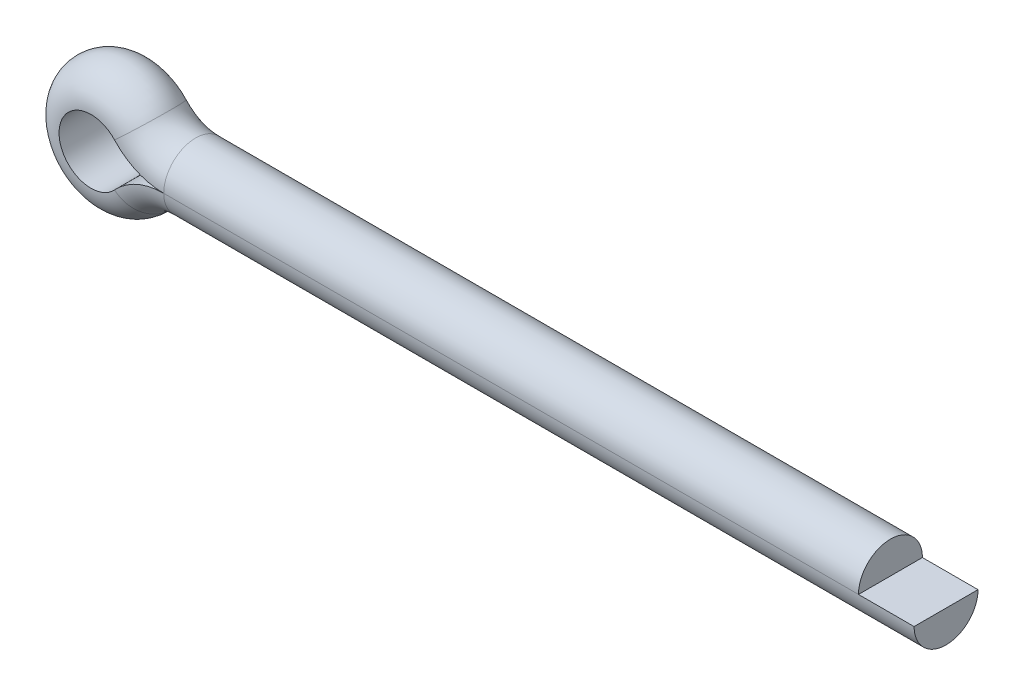
ISO-10303-21;
HEADER;
FILE_DESCRIPTION(('STEP AP214'),'2;1');
FILE_NAME('part.step','',(''),(''),'','','');
FILE_SCHEMA(('AUTOMOTIVE_DESIGN { 1 0 10303 214 1 1 1 1 }'));
ENDSEC;
DATA;
#1=APPLICATION_CONTEXT('core data for automotive mechanical design processes');
#2=APPLICATION_PROTOCOL_DEFINITION('international standard','automotive_design',2000,#1);
#3=PRODUCT_CONTEXT('',#1,'mechanical');
#4=PRODUCT('Part','Part','',(#3));
#5=PRODUCT_RELATED_PRODUCT_CATEGORY('part','',(#4));
#6=PRODUCT_DEFINITION_FORMATION('','',#4);
#7=PRODUCT_DEFINITION_CONTEXT('part definition',#1,'design');
#8=PRODUCT_DEFINITION('design','',#6,#7);
#9=PRODUCT_DEFINITION_SHAPE('','',#8);
#10=(LENGTH_UNIT() NAMED_UNIT(*) SI_UNIT(.MILLI.,.METRE.));
#11=(NAMED_UNIT(*) PLANE_ANGLE_UNIT() SI_UNIT($,.RADIAN.));
#12=(NAMED_UNIT(*) SI_UNIT($,.STERADIAN.) SOLID_ANGLE_UNIT());
#13=UNCERTAINTY_MEASURE_WITH_UNIT(LENGTH_MEASURE(1.E-05),#10,'distance_accuracy_value','');
#14=(GEOMETRIC_REPRESENTATION_CONTEXT(3) GLOBAL_UNCERTAINTY_ASSIGNED_CONTEXT((#13)) GLOBAL_UNIT_ASSIGNED_CONTEXT((#10,
#11,#12)) REPRESENTATION_CONTEXT('',''));
#15=CARTESIAN_POINT('',(0.,0.,0.));
#16=DIRECTION('',(0.,0.,1.));
#17=DIRECTION('',(1.,0.,0.));
#18=AXIS2_PLACEMENT_3D('',#15,#16,#17);
#19=CARTESIAN_POINT('',(-50.,0.,2.3));
#20=DIRECTION('',(0.,-1.,0.));
#21=DIRECTION('',(1.,0.,0.));
#22=AXIS2_PLACEMENT_3D('',#19,#20,#21);
#23=PLANE('',#22);
#24=DIRECTION('',(0.,0.,-1.));
#25=VECTOR('',#24,1.);
#26=CARTESIAN_POINT('',(-50.,0.,2.3));
#27=LINE('',#26,#25);
#28=CARTESIAN_POINT('',(-50.,0.,2.3));
#29=VERTEX_POINT('',#28);
#30=CARTESIAN_POINT('',(-50.,0.,-2.3));
#31=VERTEX_POINT('',#30);
#32=EDGE_CURVE('E140',#29,#31,#27,.T.);
#33=ORIENTED_EDGE('',*,*,#32,.F.);
#34=DIRECTION('',(1.,0.,0.));
#35=VECTOR('',#34,1.);
#36=CARTESIAN_POINT('',(-50.,0.,2.3));
#37=LINE('',#36,#35);
#38=CARTESIAN_POINT('',(4.00000000000004,0.,2.3));
#39=VERTEX_POINT('',#38);
#40=EDGE_CURVE('E40',#29,#39,#37,.T.);
#41=ORIENTED_EDGE('',*,*,#40,.T.);
#42=DIRECTION('',(0.,0.,-1.));
#43=VECTOR('',#42,1.);
#44=CARTESIAN_POINT('',(4.00000000000004,0.,2.3));
#45=LINE('',#44,#43);
#46=CARTESIAN_POINT('',(4.00000000000004,0.,-2.3));
#47=VERTEX_POINT('',#46);
#48=EDGE_CURVE('E47',#39,#47,#45,.T.);
#49=ORIENTED_EDGE('',*,*,#48,.T.);
#50=DIRECTION('',(1.,0.,0.));
#51=VECTOR('',#50,1.);
#52=CARTESIAN_POINT('',(-50.,0.,-2.3));
#53=LINE('',#52,#51);
#54=EDGE_CURVE('E11',#31,#47,#53,.T.);
#55=ORIENTED_EDGE('',*,*,#54,.F.);
#56=EDGE_LOOP('',(#33,#41,#49,#55));
#57=FACE_BOUND('',#56,.T.);
#58=ADVANCED_FACE('F33',(#57),#23,.F.);
#59=CARTESIAN_POINT('',(-50.,0.,0.));
#60=DIRECTION('',(1.,0.,0.));
#61=DIRECTION('',(0.,1.,0.));
#62=AXIS2_PLACEMENT_3D('',#59,#60,#61);
#63=CYLINDRICAL_SURFACE('',#62,2.3);
#64=CARTESIAN_POINT('',(-50.,0.,0.));
#65=DIRECTION('',(-1.,0.,0.));
#66=DIRECTION('',(0.,0.,-1.));
#67=AXIS2_PLACEMENT_3D('',#64,#65,#66);
#68=CIRCLE('',#67,2.3);
#69=EDGE_CURVE('E137',#31,#29,#68,.T.);
#70=ORIENTED_EDGE('',*,*,#69,.F.);
#71=ORIENTED_EDGE('',*,*,#54,.T.);
#72=CARTESIAN_POINT('',(4.00000000000004,0.,0.));
#73=DIRECTION('',(-1.,0.,0.));
#74=DIRECTION('',(0.,0.,-1.));
#75=AXIS2_PLACEMENT_3D('',#72,#73,#74);
#76=CIRCLE('',#75,2.3);
#77=EDGE_CURVE('E53',#47,#39,#76,.T.);
#78=ORIENTED_EDGE('',*,*,#77,.T.);
#79=ORIENTED_EDGE('',*,*,#40,.F.);
#80=EDGE_LOOP('',(#70,#71,#78,#79));
#81=FACE_BOUND('',#80,.T.);
#82=ADVANCED_FACE('F152',(#81),#63,.T.);
#83=CARTESIAN_POINT('',(-50.,-4.8,0.));
#84=DIRECTION('',(0.,0.,-1.));
#85=DIRECTION('',(-1.,0.,0.));
#86=AXIS2_PLACEMENT_3D('',#83,#84,#85);
#87=CYLINDRICAL_SURFACE('',#86,4.8);
#88=DIRECTION('',(0.,0.,-1.));
#89=VECTOR('',#88,1.);
#90=CARTESIAN_POINT('',(-53.5368796915907,-1.55492957746476,2.3));
#91=LINE('',#90,#89);
#92=CARTESIAN_POINT('',(-53.5368796915907,-1.55492957746476,2.3));
#93=VERTEX_POINT('',#92);
#94=CARTESIAN_POINT('',(-53.5368796915907,-1.55492957746476,-2.3));
#95=VERTEX_POINT('',#94);
#96=EDGE_CURVE('E128',#93,#95,#91,.T.);
#97=ORIENTED_EDGE('',*,*,#96,.F.);
#98=CARTESIAN_POINT('',(-50.,-4.8,2.3));
#99=DIRECTION('',(0.,0.,-1.));
#100=DIRECTION('',(-1.,0.,0.));
#101=AXIS2_PLACEMENT_3D('',#98,#99,#100);
#102=CIRCLE('',#101,4.8);
#103=EDGE_CURVE('E143',#93,#29,#102,.T.);
#104=ORIENTED_EDGE('',*,*,#103,.T.);
#105=ORIENTED_EDGE('',*,*,#32,.T.);
#106=CARTESIAN_POINT('',(-50.,-4.8,-2.3));
#107=DIRECTION('',(0.,0.,-1.));
#108=DIRECTION('',(-1.,0.,0.));
#109=AXIS2_PLACEMENT_3D('',#106,#107,#108);
#110=CIRCLE('',#109,4.8);
#111=EDGE_CURVE('E146',#95,#31,#110,.T.);
#112=ORIENTED_EDGE('',*,*,#111,.F.);
#113=EDGE_LOOP('',(#97,#104,#105,#112));
#114=FACE_BOUND('',#113,.T.);
#115=ADVANCED_FACE('F156',(#114),#87,.T.);
#116=CARTESIAN_POINT('',(-50.,-4.8,0.));
#117=DIRECTION('',(0.,0.,-1.));
#118=DIRECTION('',(-1.,0.,0.));
#119=AXIS2_PLACEMENT_3D('',#116,#117,#118);
#120=TOROIDAL_SURFACE('',#119,4.8,2.3);
#121=CARTESIAN_POINT('',(-53.5368796915907,-1.55492957746476,0.));
#122=DIRECTION('',(-0.676056338028158,-0.736849935748085,0.));
#123=DIRECTION('',(0.,0.,-1.));
#124=AXIS2_PLACEMENT_3D('',#121,#122,#123);
#125=CIRCLE('',#124,2.3);
#126=EDGE_CURVE('E125',#95,#93,#125,.T.);
#127=ORIENTED_EDGE('',*,*,#126,.F.);
#128=ORIENTED_EDGE('',*,*,#111,.T.);
#129=ORIENTED_EDGE('',*,*,#69,.T.);
#130=ORIENTED_EDGE('',*,*,#103,.F.);
#131=EDGE_LOOP('',(#127,#128,#129,#130));
#132=FACE_BOUND('',#131,.T.);
#133=ADVANCED_FACE('F158',(#132),#120,.T.);
#134=CARTESIAN_POINT('',(-55.2316345438113,0.,0.));
#135=DIRECTION('',(0.,0.,1.));
#136=DIRECTION('',(1.,0.,0.));
#137=AXIS2_PLACEMENT_3D('',#134,#135,#136);
#138=CYLINDRICAL_SURFACE('',#137,2.3);
#139=DIRECTION('',(0.,0.,-1.));
#140=VECTOR('',#139,1.);
#141=CARTESIAN_POINT('',(-53.5368796915908,1.55492957746479,2.3));
#142=LINE('',#141,#140);
#143=CARTESIAN_POINT('',(-53.5368796915908,1.55492957746479,2.3));
#144=VERTEX_POINT('',#143);
#145=CARTESIAN_POINT('',(-53.5368796915908,1.55492957746479,-2.3));
#146=VERTEX_POINT('',#145);
#147=EDGE_CURVE('E97',#144,#146,#142,.T.);
#148=ORIENTED_EDGE('',*,*,#147,.F.);
#149=CARTESIAN_POINT('',(-55.2316345438113,0.,2.3));
#150=DIRECTION('',(0.,0.,1.));
#151=DIRECTION('',(1.,0.,0.));
#152=AXIS2_PLACEMENT_3D('',#149,#150,#151);
#153=CIRCLE('',#152,2.3);
#154=EDGE_CURVE('E131',#144,#93,#153,.T.);
#155=ORIENTED_EDGE('',*,*,#154,.T.);
#156=ORIENTED_EDGE('',*,*,#96,.T.);
#157=CARTESIAN_POINT('',(-55.2316345438113,0.,-2.3));
#158=DIRECTION('',(0.,0.,1.));
#159=DIRECTION('',(1.,0.,0.));
#160=AXIS2_PLACEMENT_3D('',#157,#158,#159);
#161=CIRCLE('',#160,2.3);
#162=EDGE_CURVE('E134',#146,#95,#161,.T.);
#163=ORIENTED_EDGE('',*,*,#162,.F.);
#164=EDGE_LOOP('',(#148,#155,#156,#163));
#165=FACE_BOUND('',#164,.T.);
#166=ADVANCED_FACE('F162',(#165),#138,.F.);
#167=CARTESIAN_POINT('',(-55.2316345438113,0.,0.));
#168=DIRECTION('',(0.,0.,1.));
#169=DIRECTION('',(1.,0.,0.));
#170=AXIS2_PLACEMENT_3D('',#167,#168,#169);
#171=DEGENERATE_TOROIDAL_SURFACE('',#170,2.3,2.3,.T.);
#172=CARTESIAN_POINT('',(-53.5368796915908,1.55492957746479,0.));
#173=DIRECTION('',(0.67605633802817,-0.736849935748074,0.));
#174=DIRECTION('',(0.,0.,-1.));
#175=AXIS2_PLACEMENT_3D('',#172,#173,#174);
#176=CIRCLE('',#175,2.3);
#177=EDGE_CURVE('E93',#146,#144,#176,.T.);
#178=ORIENTED_EDGE('',*,*,#177,.F.);
#179=ORIENTED_EDGE('',*,*,#162,.T.);
#180=ORIENTED_EDGE('',*,*,#126,.T.);
#181=ORIENTED_EDGE('',*,*,#154,.F.);
#182=EDGE_LOOP('',(#178,#179,#180,#181));
#183=FACE_BOUND('',#182,.T.);
#184=ADVANCED_FACE('F163',(#183),#171,.T.);
#185=CARTESIAN_POINT('',(-50.,4.8,0.));
#186=DIRECTION('',(0.,0.,-1.));
#187=DIRECTION('',(-1.,0.,0.));
#188=AXIS2_PLACEMENT_3D('',#185,#186,#187);
#189=CYLINDRICAL_SURFACE('',#188,4.8);
#190=DIRECTION('',(0.,0.,-1.));
#191=VECTOR('',#190,1.);
#192=CARTESIAN_POINT('',(-50.,0.,2.3));
#193=LINE('',#192,#191);
#194=CARTESIAN_POINT('',(-50.,0.,2.3));
#195=VERTEX_POINT('',#194);
#196=CARTESIAN_POINT('',(-50.,0.,-2.3));
#197=VERTEX_POINT('',#196);
#198=EDGE_CURVE('E100',#195,#197,#193,.T.);
#199=ORIENTED_EDGE('',*,*,#198,.F.);
#200=CARTESIAN_POINT('',(-50.,4.8,2.3));
#201=DIRECTION('',(0.,0.,-1.));
#202=DIRECTION('',(-1.,0.,0.));
#203=AXIS2_PLACEMENT_3D('',#200,#201,#202);
#204=CIRCLE('',#203,4.8);
#205=EDGE_CURVE('E85',#195,#144,#204,.T.);
#206=ORIENTED_EDGE('',*,*,#205,.T.);
#207=ORIENTED_EDGE('',*,*,#147,.T.);
#208=CARTESIAN_POINT('',(-50.,4.8,-2.3));
#209=DIRECTION('',(0.,0.,-1.));
#210=DIRECTION('',(-1.,0.,0.));
#211=AXIS2_PLACEMENT_3D('',#208,#209,#210);
#212=CIRCLE('',#211,4.8);
#213=EDGE_CURVE('E96',#197,#146,#212,.T.);
#214=ORIENTED_EDGE('',*,*,#213,.F.);
#215=EDGE_LOOP('',(#199,#206,#207,#214));
#216=FACE_BOUND('',#215,.T.);
#217=ADVANCED_FACE('F102',(#216),#189,.T.);
#218=CARTESIAN_POINT('',(-50.,4.8,0.));
#219=DIRECTION('',(0.,0.,-1.));
#220=DIRECTION('',(-1.,0.,0.));
#221=AXIS2_PLACEMENT_3D('',#218,#219,#220);
#222=TOROIDAL_SURFACE('',#221,4.8,2.3);
#223=CARTESIAN_POINT('',(-50.,0.,0.));
#224=DIRECTION('',(1.,0.,0.));
#225=DIRECTION('',(0.,0.,-1.));
#226=AXIS2_PLACEMENT_3D('',#223,#224,#225);
#227=CIRCLE('',#226,2.3);
#228=EDGE_CURVE('E90',#197,#195,#227,.T.);
#229=ORIENTED_EDGE('',*,*,#228,.F.);
#230=ORIENTED_EDGE('',*,*,#213,.T.);
#231=ORIENTED_EDGE('',*,*,#177,.T.);
#232=ORIENTED_EDGE('',*,*,#205,.F.);
#233=EDGE_LOOP('',(#229,#230,#231,#232));
#234=FACE_BOUND('',#233,.T.);
#235=ADVANCED_FACE('F87',(#234),#222,.T.);
#236=CARTESIAN_POINT('',(-50.,0.,0.));
#237=DIRECTION('',(1.,0.,0.));
#238=DIRECTION('',(0.,0.,-1.));
#239=AXIS2_PLACEMENT_3D('',#236,#237,#238);
#240=CYLINDRICAL_SURFACE('',#239,2.3);
#241=CARTESIAN_POINT('',(0.,0.,0.));
#242=DIRECTION('',(1.,0.,0.));
#243=DIRECTION('',(0.,0.,-1.));
#244=AXIS2_PLACEMENT_3D('',#241,#242,#243);
#245=CIRCLE('',#244,2.3);
#246=CARTESIAN_POINT('',(0.,0.,-2.3));
#247=VERTEX_POINT('',#246);
#248=CARTESIAN_POINT('',(0.,0.,2.3));
#249=VERTEX_POINT('',#248);
#250=EDGE_CURVE('E117',#247,#249,#245,.T.);
#251=ORIENTED_EDGE('',*,*,#250,.F.);
#252=DIRECTION('',(1.,0.,0.));
#253=VECTOR('',#252,1.);
#254=CARTESIAN_POINT('',(-50.,0.,-2.3));
#255=LINE('',#254,#253);
#256=EDGE_CURVE('E113',#197,#247,#255,.T.);
#257=ORIENTED_EDGE('',*,*,#256,.F.);
#258=ORIENTED_EDGE('',*,*,#228,.T.);
#259=DIRECTION('',(1.,0.,0.));
#260=VECTOR('',#259,1.);
#261=CARTESIAN_POINT('',(-50.,0.,2.3));
#262=LINE('',#261,#260);
#263=EDGE_CURVE('E104',#195,#249,#262,.T.);
#264=ORIENTED_EDGE('',*,*,#263,.T.);
#265=EDGE_LOOP('',(#251,#257,#258,#264));
#266=FACE_BOUND('',#265,.T.);
#267=ADVANCED_FACE('F115',(#266),#240,.T.);
#268=CARTESIAN_POINT('',(-50.,0.,2.3));
#269=DIRECTION('',(0.,-1.,0.));
#270=DIRECTION('',(0.,0.,-1.));
#271=AXIS2_PLACEMENT_3D('',#268,#269,#270);
#272=PLANE('',#271);
#273=DIRECTION('',(0.,0.,-1.));
#274=VECTOR('',#273,1.);
#275=CARTESIAN_POINT('',(0.,0.,2.3));
#276=LINE('',#275,#274);
#277=EDGE_CURVE('E109',#249,#247,#276,.T.);
#278=ORIENTED_EDGE('',*,*,#277,.F.);
#279=ORIENTED_EDGE('',*,*,#263,.F.);
#280=ORIENTED_EDGE('',*,*,#198,.T.);
#281=ORIENTED_EDGE('',*,*,#256,.T.);
#282=EDGE_LOOP('',(#278,#279,#280,#281));
#283=FACE_BOUND('',#282,.T.);
#284=ADVANCED_FACE('F107',(#283),#272,.T.);
#285=CARTESIAN_POINT('',(4.00000000000004,0.,0.));
#286=DIRECTION('',(-1.,0.,0.));
#287=DIRECTION('',(0.,0.,-1.));
#288=AXIS2_PLACEMENT_3D('',#285,#286,#287);
#289=PLANE('',#288);
#290=ORIENTED_EDGE('',*,*,#77,.F.);
#291=ORIENTED_EDGE('',*,*,#48,.F.);
#292=EDGE_LOOP('',(#290,#291));
#293=FACE_BOUND('',#292,.T.);
#294=ADVANCED_FACE('F225',(#293),#289,.F.);
#295=CARTESIAN_POINT('',(0.,0.,0.));
#296=DIRECTION('',(1.,0.,0.));
#297=DIRECTION('',(0.,0.,-1.));
#298=AXIS2_PLACEMENT_3D('',#295,#296,#297);
#299=PLANE('',#298);
#300=ORIENTED_EDGE('',*,*,#250,.T.);
#301=ORIENTED_EDGE('',*,*,#277,.T.);
#302=EDGE_LOOP('',(#300,#301));
#303=FACE_BOUND('',#302,.T.);
#304=ADVANCED_FACE('F234',(#303),#299,.T.);
#305=CLOSED_SHELL('',(#58,#82,#115,#133,#166,#184,#217,#235,#267,#284,#294,#304));
#306=MANIFOLD_SOLID_BREP('B2',#305);
#307=ADVANCED_BREP_SHAPE_REPRESENTATION('',(#18,#306),#14);
#308=SHAPE_DEFINITION_REPRESENTATION(#9,#307);
ENDSEC;
END-ISO-10303-21;
